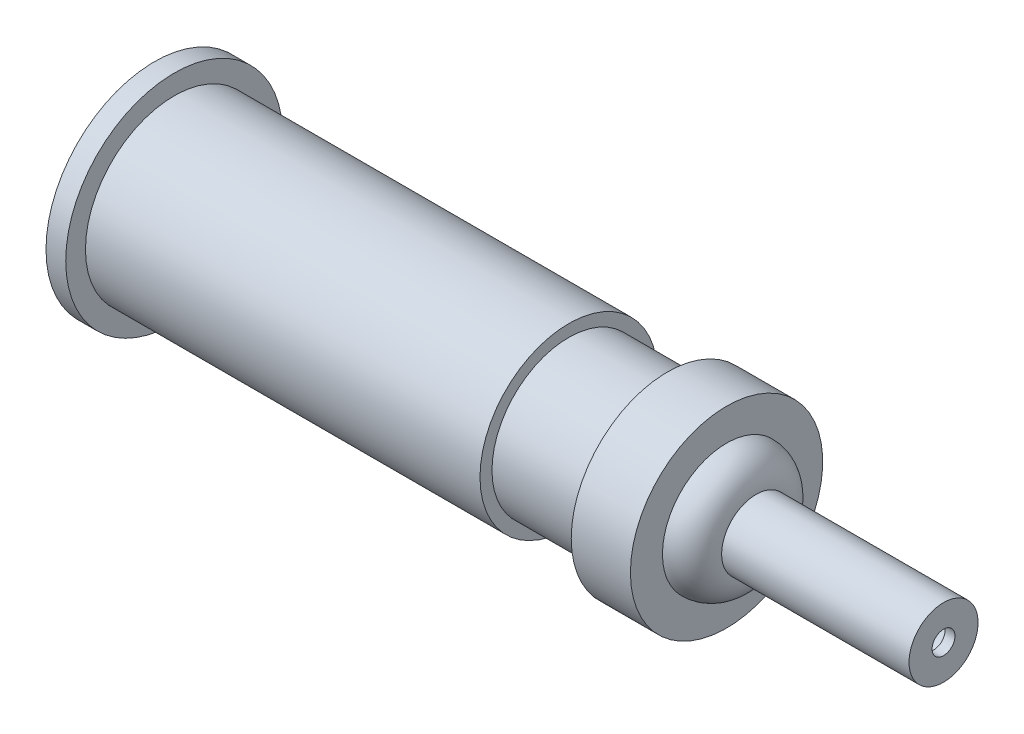
ISO-10303-21;
HEADER;
FILE_DESCRIPTION(('STEP AP214'),'2;1');
FILE_NAME('part.step','',(''),(''),'','','');
FILE_SCHEMA(('AUTOMOTIVE_DESIGN { 1 0 10303 214 1 1 1 1 }'));
ENDSEC;
DATA;
#1=APPLICATION_CONTEXT('core data for automotive mechanical design processes');
#2=APPLICATION_PROTOCOL_DEFINITION('international standard','automotive_design',2000,#1);
#3=PRODUCT_CONTEXT('',#1,'mechanical');
#4=PRODUCT('Part','Part','',(#3));
#5=PRODUCT_RELATED_PRODUCT_CATEGORY('part','',(#4));
#6=PRODUCT_DEFINITION_FORMATION('','',#4);
#7=PRODUCT_DEFINITION_CONTEXT('part definition',#1,'design');
#8=PRODUCT_DEFINITION('design','',#6,#7);
#9=PRODUCT_DEFINITION_SHAPE('','',#8);
#10=(LENGTH_UNIT() NAMED_UNIT(*) SI_UNIT(.MILLI.,.METRE.));
#11=(NAMED_UNIT(*) PLANE_ANGLE_UNIT() SI_UNIT($,.RADIAN.));
#12=(NAMED_UNIT(*) SI_UNIT($,.STERADIAN.) SOLID_ANGLE_UNIT());
#13=UNCERTAINTY_MEASURE_WITH_UNIT(LENGTH_MEASURE(1.E-05),#10,'distance_accuracy_value','');
#14=(GEOMETRIC_REPRESENTATION_CONTEXT(3) GLOBAL_UNCERTAINTY_ASSIGNED_CONTEXT((#13)) GLOBAL_UNIT_ASSIGNED_CONTEXT((#10,
#11,#12)) REPRESENTATION_CONTEXT('',''));
#15=CARTESIAN_POINT('',(0.,0.,0.));
#16=DIRECTION('',(0.,0.,1.));
#17=DIRECTION('',(1.,0.,0.));
#18=AXIS2_PLACEMENT_3D('',#15,#16,#17);
#19=CARTESIAN_POINT('',(79.,3.5,0.));
#20=DIRECTION('',(1.,0.,0.));
#21=DIRECTION('',(0.,0.,-1.));
#22=AXIS2_PLACEMENT_3D('',#19,#20,#21);
#23=PLANE('',#22);
#24=CARTESIAN_POINT('',(79.,0.,0.));
#25=DIRECTION('',(-1.,0.,0.));
#26=DIRECTION('',(0.,0.,1.));
#27=AXIS2_PLACEMENT_3D('',#24,#25,#26);
#28=CIRCLE('',#27,1.1608187134503);
#29=CARTESIAN_POINT('',(79.,0.,1.1608187134503));
#30=VERTEX_POINT('',#29);
#31=EDGE_CURVE('E132',#30,#30,#28,.T.);
#32=ORIENTED_EDGE('',*,*,#31,.F.);
#33=EDGE_LOOP('',(#32));
#34=FACE_BOUND('',#33,.T.);
#35=CARTESIAN_POINT('',(79.,0.,0.));
#36=DIRECTION('',(-1.,0.,0.));
#37=DIRECTION('',(0.,0.,1.));
#38=AXIS2_PLACEMENT_3D('',#35,#36,#37);
#39=CIRCLE('',#38,2.5);
#40=CARTESIAN_POINT('',(79.,0.,2.5));
#41=VERTEX_POINT('',#40);
#42=EDGE_CURVE('E10',#41,#41,#39,.T.);
#43=ORIENTED_EDGE('',*,*,#42,.T.);
#44=EDGE_LOOP('',(#43));
#45=FACE_BOUND('',#44,.T.);
#46=ADVANCED_FACE('F41',(#34,#45),#23,.F.);
#47=CARTESIAN_POINT('',(0.,0.,0.));
#48=DIRECTION('',(-1.,0.,0.));
#49=DIRECTION('',(0.,0.,1.));
#50=AXIS2_PLACEMENT_3D('',#47,#48,#49);
#51=CYLINDRICAL_SURFACE('',#50,2.5);
#52=ORIENTED_EDGE('',*,*,#42,.F.);
#53=EDGE_LOOP('',(#52));
#54=FACE_BOUND('',#53,.T.);
#55=CARTESIAN_POINT('',(59.7320508075689,0.,0.));
#56=DIRECTION('',(-1.,0.,0.));
#57=DIRECTION('',(0.,0.,1.));
#58=AXIS2_PLACEMENT_3D('',#55,#56,#57);
#59=CIRCLE('',#58,2.5);
#60=CARTESIAN_POINT('',(59.7320508075689,0.,2.5));
#61=VERTEX_POINT('',#60);
#62=EDGE_CURVE('E48',#61,#61,#59,.T.);
#63=ORIENTED_EDGE('',*,*,#62,.T.);
#64=EDGE_LOOP('',(#63));
#65=FACE_BOUND('',#64,.T.);
#66=ADVANCED_FACE('F141',(#54,#65),#51,.F.);
#67=CARTESIAN_POINT('',(58.,0.,0.));
#68=DIRECTION('',(-1.,0.,0.));
#69=DIRECTION('',(0.,0.,1.));
#70=AXIS2_PLACEMENT_3D('',#67,#68,#69);
#71=TOROIDAL_SURFACE('',#70,3.5,2.);
#72=ORIENTED_EDGE('',*,*,#62,.F.);
#73=EDGE_LOOP('',(#72));
#74=FACE_BOUND('',#73,.T.);
#75=CARTESIAN_POINT('',(57.,0.,0.));
#76=DIRECTION('',(-1.,0.,0.));
#77=DIRECTION('',(0.,0.,1.));
#78=AXIS2_PLACEMENT_3D('',#75,#76,#77);
#79=CIRCLE('',#78,5.23205080756888);
#80=CARTESIAN_POINT('',(57.,0.,5.23205080756888));
#81=VERTEX_POINT('',#80);
#82=EDGE_CURVE('E53',#81,#81,#79,.T.);
#83=ORIENTED_EDGE('',*,*,#82,.T.);
#84=EDGE_LOOP('',(#83));
#85=FACE_BOUND('',#84,.T.);
#86=ADVANCED_FACE('F145',(#74,#85),#71,.F.);
#87=CARTESIAN_POINT('',(57.,9.7485380116959,0.));
#88=DIRECTION('',(1.,0.,0.));
#89=DIRECTION('',(0.,0.,-1.));
#90=AXIS2_PLACEMENT_3D('',#87,#88,#89);
#91=PLANE('',#90);
#92=ORIENTED_EDGE('',*,*,#82,.F.);
#93=EDGE_LOOP('',(#92));
#94=FACE_BOUND('',#93,.T.);
#95=CARTESIAN_POINT('',(57.,0.,0.));
#96=DIRECTION('',(-1.,0.,0.));
#97=DIRECTION('',(0.,0.,1.));
#98=AXIS2_PLACEMENT_3D('',#95,#96,#97);
#99=CIRCLE('',#98,8.7485380116959);
#100=CARTESIAN_POINT('',(57.,0.,8.7485380116959));
#101=VERTEX_POINT('',#100);
#102=EDGE_CURVE('E58',#101,#101,#99,.T.);
#103=ORIENTED_EDGE('',*,*,#102,.T.);
#104=EDGE_LOOP('',(#103));
#105=FACE_BOUND('',#104,.T.);
#106=ADVANCED_FACE('F150',(#94,#105),#91,.F.);
#107=CARTESIAN_POINT('',(0.,0.,0.));
#108=DIRECTION('',(-1.,0.,0.));
#109=DIRECTION('',(0.,0.,1.));
#110=AXIS2_PLACEMENT_3D('',#107,#108,#109);
#111=CYLINDRICAL_SURFACE('',#110,8.7485380116959);
#112=ORIENTED_EDGE('',*,*,#102,.F.);
#113=EDGE_LOOP('',(#112));
#114=FACE_BOUND('',#113,.T.);
#115=CARTESIAN_POINT('',(53.,0.,0.));
#116=DIRECTION('',(-1.,0.,0.));
#117=DIRECTION('',(0.,0.,1.));
#118=AXIS2_PLACEMENT_3D('',#115,#116,#117);
#119=CIRCLE('',#118,8.7485380116959);
#120=CARTESIAN_POINT('',(53.,0.,8.7485380116959));
#121=VERTEX_POINT('',#120);
#122=EDGE_CURVE('E64',#121,#121,#119,.T.);
#123=ORIENTED_EDGE('',*,*,#122,.T.);
#124=EDGE_LOOP('',(#123));
#125=FACE_BOUND('',#124,.T.);
#126=ADVANCED_FACE('F156',(#114,#125),#111,.F.);
#127=CARTESIAN_POINT('',(53.,7.78362573099415,0.));
#128=DIRECTION('',(-1.,0.,0.));
#129=DIRECTION('',(0.,0.,1.));
#130=AXIS2_PLACEMENT_3D('',#127,#128,#129);
#131=PLANE('',#130);
#132=ORIENTED_EDGE('',*,*,#122,.F.);
#133=EDGE_LOOP('',(#132));
#134=FACE_BOUND('',#133,.T.);
#135=CARTESIAN_POINT('',(53.,0.,0.));
#136=DIRECTION('',(-1.,0.,0.));
#137=DIRECTION('',(0.,0.,1.));
#138=AXIS2_PLACEMENT_3D('',#135,#136,#137);
#139=CIRCLE('',#138,6.78362573099415);
#140=CARTESIAN_POINT('',(53.,0.,6.78362573099415));
#141=VERTEX_POINT('',#140);
#142=EDGE_CURVE('E68',#141,#141,#139,.T.);
#143=ORIENTED_EDGE('',*,*,#142,.T.);
#144=EDGE_LOOP('',(#143));
#145=FACE_BOUND('',#144,.T.);
#146=ADVANCED_FACE('F160',(#134,#145),#131,.F.);
#147=CARTESIAN_POINT('',(0.,0.,0.));
#148=DIRECTION('',(-1.,0.,0.));
#149=DIRECTION('',(0.,0.,1.));
#150=AXIS2_PLACEMENT_3D('',#147,#148,#149);
#151=CYLINDRICAL_SURFACE('',#150,6.78362573099415);
#152=ORIENTED_EDGE('',*,*,#142,.F.);
#153=EDGE_LOOP('',(#152));
#154=FACE_BOUND('',#153,.T.);
#155=CARTESIAN_POINT('',(41.,0.,0.));
#156=DIRECTION('',(-1.,0.,0.));
#157=DIRECTION('',(0.,0.,1.));
#158=AXIS2_PLACEMENT_3D('',#155,#156,#157);
#159=CIRCLE('',#158,6.78362573099415);
#160=CARTESIAN_POINT('',(41.,0.,6.78362573099415));
#161=VERTEX_POINT('',#160);
#162=EDGE_CURVE('E72',#161,#161,#159,.T.);
#163=ORIENTED_EDGE('',*,*,#162,.T.);
#164=EDGE_LOOP('',(#163));
#165=FACE_BOUND('',#164,.T.);
#166=ADVANCED_FACE('F164',(#154,#165),#151,.F.);
#167=CARTESIAN_POINT('',(41.,9.,0.));
#168=DIRECTION('',(1.,0.,0.));
#169=DIRECTION('',(0.,0.,-1.));
#170=AXIS2_PLACEMENT_3D('',#167,#168,#169);
#171=PLANE('',#170);
#172=ORIENTED_EDGE('',*,*,#162,.F.);
#173=EDGE_LOOP('',(#172));
#174=FACE_BOUND('',#173,.T.);
#175=CARTESIAN_POINT('',(41.,0.,0.));
#176=DIRECTION('',(-1.,0.,0.));
#177=DIRECTION('',(0.,0.,1.));
#178=AXIS2_PLACEMENT_3D('',#175,#176,#177);
#179=CIRCLE('',#178,8.);
#180=CARTESIAN_POINT('',(41.,0.,8.));
#181=VERTEX_POINT('',#180);
#182=EDGE_CURVE('E76',#181,#181,#179,.T.);
#183=ORIENTED_EDGE('',*,*,#182,.T.);
#184=EDGE_LOOP('',(#183));
#185=FACE_BOUND('',#184,.T.);
#186=ADVANCED_FACE('F168',(#174,#185),#171,.F.);
#187=CARTESIAN_POINT('',(0.,0.,0.));
#188=DIRECTION('',(-1.,0.,0.));
#189=DIRECTION('',(0.,0.,1.));
#190=AXIS2_PLACEMENT_3D('',#187,#188,#189);
#191=CYLINDRICAL_SURFACE('',#190,8.);
#192=ORIENTED_EDGE('',*,*,#182,.F.);
#193=EDGE_LOOP('',(#192));
#194=FACE_BOUND('',#193,.T.);
#195=CARTESIAN_POINT('',(1.,0.,0.));
#196=DIRECTION('',(-1.,0.,0.));
#197=DIRECTION('',(0.,0.,1.));
#198=AXIS2_PLACEMENT_3D('',#195,#196,#197);
#199=CIRCLE('',#198,8.);
#200=CARTESIAN_POINT('',(1.,0.,8.));
#201=VERTEX_POINT('',#200);
#202=EDGE_CURVE('E80',#201,#201,#199,.T.);
#203=ORIENTED_EDGE('',*,*,#202,.T.);
#204=EDGE_LOOP('',(#203));
#205=FACE_BOUND('',#204,.T.);
#206=ADVANCED_FACE('F172',(#194,#205),#191,.F.);
#207=CARTESIAN_POINT('',(1.,0.,0.));
#208=DIRECTION('',(-1.,0.,0.));
#209=DIRECTION('',(0.,0.,1.));
#210=AXIS2_PLACEMENT_3D('',#207,#208,#209);
#211=PLANE('',#210);
#212=ORIENTED_EDGE('',*,*,#202,.F.);
#213=EDGE_LOOP('',(#212));
#214=FACE_BOUND('',#213,.T.);
#215=ADVANCED_FACE('F176',(#214),#211,.F.);
#216=CARTESIAN_POINT('',(0.,0.,0.));
#217=DIRECTION('',(-1.,0.,0.));
#218=DIRECTION('',(0.,0.,1.));
#219=AXIS2_PLACEMENT_3D('',#216,#217,#218);
#220=PLANE('',#219);
#221=CARTESIAN_POINT('',(0.,0.,0.));
#222=DIRECTION('',(-1.,0.,0.));
#223=DIRECTION('',(0.,0.,1.));
#224=AXIS2_PLACEMENT_3D('',#221,#222,#223);
#225=CIRCLE('',#224,11.);
#226=CARTESIAN_POINT('',(0.,0.,11.));
#227=VERTEX_POINT('',#226);
#228=EDGE_CURVE('E84',#227,#227,#225,.T.);
#229=ORIENTED_EDGE('',*,*,#228,.T.);
#230=EDGE_LOOP('',(#229));
#231=FACE_BOUND('',#230,.T.);
#232=ADVANCED_FACE('F180',(#231),#220,.T.);
#233=CARTESIAN_POINT('',(0.,0.,0.));
#234=DIRECTION('',(-1.,0.,0.));
#235=DIRECTION('',(0.,0.,1.));
#236=AXIS2_PLACEMENT_3D('',#233,#234,#235);
#237=CYLINDRICAL_SURFACE('',#236,11.);
#238=CARTESIAN_POINT('',(2.,0.,0.));
#239=DIRECTION('',(-1.,0.,0.));
#240=DIRECTION('',(0.,0.,1.));
#241=AXIS2_PLACEMENT_3D('',#238,#239,#240);
#242=CIRCLE('',#241,11.);
#243=CARTESIAN_POINT('',(2.,0.,11.));
#244=VERTEX_POINT('',#243);
#245=EDGE_CURVE('E88',#244,#244,#242,.T.);
#246=ORIENTED_EDGE('',*,*,#245,.T.);
#247=EDGE_LOOP('',(#246));
#248=FACE_BOUND('',#247,.T.);
#249=ORIENTED_EDGE('',*,*,#228,.F.);
#250=EDGE_LOOP('',(#249));
#251=FACE_BOUND('',#250,.T.);
#252=ADVANCED_FACE('F184',(#248,#251),#237,.T.);
#253=CARTESIAN_POINT('',(2.,11.,0.));
#254=DIRECTION('',(1.,0.,0.));
#255=DIRECTION('',(0.,0.,-1.));
#256=AXIS2_PLACEMENT_3D('',#253,#254,#255);
#257=PLANE('',#256);
#258=CARTESIAN_POINT('',(2.,0.,0.));
#259=DIRECTION('',(-1.,0.,0.));
#260=DIRECTION('',(0.,0.,1.));
#261=AXIS2_PLACEMENT_3D('',#258,#259,#260);
#262=CIRCLE('',#261,9.);
#263=CARTESIAN_POINT('',(2.,0.,9.));
#264=VERTEX_POINT('',#263);
#265=EDGE_CURVE('E92',#264,#264,#262,.T.);
#266=ORIENTED_EDGE('',*,*,#265,.T.);
#267=EDGE_LOOP('',(#266));
#268=FACE_BOUND('',#267,.T.);
#269=ORIENTED_EDGE('',*,*,#245,.F.);
#270=EDGE_LOOP('',(#269));
#271=FACE_BOUND('',#270,.T.);
#272=ADVANCED_FACE('F188',(#268,#271),#257,.T.);
#273=CARTESIAN_POINT('',(0.,0.,0.));
#274=DIRECTION('',(-1.,0.,0.));
#275=DIRECTION('',(0.,0.,1.));
#276=AXIS2_PLACEMENT_3D('',#273,#274,#275);
#277=CYLINDRICAL_SURFACE('',#276,9.);
#278=CARTESIAN_POINT('',(42.,0.,0.));
#279=DIRECTION('',(-1.,0.,0.));
#280=DIRECTION('',(0.,0.,1.));
#281=AXIS2_PLACEMENT_3D('',#278,#279,#280);
#282=CIRCLE('',#281,9.);
#283=CARTESIAN_POINT('',(42.,0.,9.));
#284=VERTEX_POINT('',#283);
#285=EDGE_CURVE('E96',#284,#284,#282,.T.);
#286=ORIENTED_EDGE('',*,*,#285,.T.);
#287=EDGE_LOOP('',(#286));
#288=FACE_BOUND('',#287,.T.);
#289=ORIENTED_EDGE('',*,*,#265,.F.);
#290=EDGE_LOOP('',(#289));
#291=FACE_BOUND('',#290,.T.);
#292=ADVANCED_FACE('F192',(#288,#291),#277,.T.);
#293=CARTESIAN_POINT('',(42.,9.,0.));
#294=DIRECTION('',(1.,0.,0.));
#295=DIRECTION('',(0.,0.,-1.));
#296=AXIS2_PLACEMENT_3D('',#293,#294,#295);
#297=PLANE('',#296);
#298=CARTESIAN_POINT('',(42.,0.,0.));
#299=DIRECTION('',(-1.,0.,0.));
#300=DIRECTION('',(0.,0.,1.));
#301=AXIS2_PLACEMENT_3D('',#298,#299,#300);
#302=CIRCLE('',#301,7.78362573099415);
#303=CARTESIAN_POINT('',(42.,0.,7.78362573099415));
#304=VERTEX_POINT('',#303);
#305=EDGE_CURVE('E100',#304,#304,#302,.T.);
#306=ORIENTED_EDGE('',*,*,#305,.T.);
#307=EDGE_LOOP('',(#306));
#308=FACE_BOUND('',#307,.T.);
#309=ORIENTED_EDGE('',*,*,#285,.F.);
#310=EDGE_LOOP('',(#309));
#311=FACE_BOUND('',#310,.T.);
#312=ADVANCED_FACE('F196',(#308,#311),#297,.T.);
#313=CARTESIAN_POINT('',(0.,0.,0.));
#314=DIRECTION('',(-1.,0.,0.));
#315=DIRECTION('',(0.,0.,1.));
#316=AXIS2_PLACEMENT_3D('',#313,#314,#315);
#317=CYLINDRICAL_SURFACE('',#316,7.78362573099415);
#318=CARTESIAN_POINT('',(52.,0.,0.));
#319=DIRECTION('',(-1.,0.,0.));
#320=DIRECTION('',(0.,0.,1.));
#321=AXIS2_PLACEMENT_3D('',#318,#319,#320);
#322=CIRCLE('',#321,7.78362573099415);
#323=CARTESIAN_POINT('',(52.,0.,7.78362573099415));
#324=VERTEX_POINT('',#323);
#325=EDGE_CURVE('E104',#324,#324,#322,.T.);
#326=ORIENTED_EDGE('',*,*,#325,.T.);
#327=EDGE_LOOP('',(#326));
#328=FACE_BOUND('',#327,.T.);
#329=ORIENTED_EDGE('',*,*,#305,.F.);
#330=EDGE_LOOP('',(#329));
#331=FACE_BOUND('',#330,.T.);
#332=ADVANCED_FACE('F200',(#328,#331),#317,.T.);
#333=CARTESIAN_POINT('',(52.,7.78362573099415,0.));
#334=DIRECTION('',(-1.,0.,0.));
#335=DIRECTION('',(0.,0.,1.));
#336=AXIS2_PLACEMENT_3D('',#333,#334,#335);
#337=PLANE('',#336);
#338=CARTESIAN_POINT('',(52.,0.,0.));
#339=DIRECTION('',(-1.,0.,0.));
#340=DIRECTION('',(0.,0.,1.));
#341=AXIS2_PLACEMENT_3D('',#338,#339,#340);
#342=CIRCLE('',#341,9.7485380116959);
#343=CARTESIAN_POINT('',(52.,0.,9.7485380116959));
#344=VERTEX_POINT('',#343);
#345=EDGE_CURVE('E108',#344,#344,#342,.T.);
#346=ORIENTED_EDGE('',*,*,#345,.T.);
#347=EDGE_LOOP('',(#346));
#348=FACE_BOUND('',#347,.T.);
#349=ORIENTED_EDGE('',*,*,#325,.F.);
#350=EDGE_LOOP('',(#349));
#351=FACE_BOUND('',#350,.T.);
#352=ADVANCED_FACE('F204',(#348,#351),#337,.T.);
#353=CARTESIAN_POINT('',(0.,0.,0.));
#354=DIRECTION('',(-1.,0.,0.));
#355=DIRECTION('',(0.,0.,1.));
#356=AXIS2_PLACEMENT_3D('',#353,#354,#355);
#357=CYLINDRICAL_SURFACE('',#356,9.7485380116959);
#358=CARTESIAN_POINT('',(58.,0.,0.));
#359=DIRECTION('',(-1.,0.,0.));
#360=DIRECTION('',(0.,0.,1.));
#361=AXIS2_PLACEMENT_3D('',#358,#359,#360);
#362=CIRCLE('',#361,9.7485380116959);
#363=CARTESIAN_POINT('',(58.,0.,9.7485380116959));
#364=VERTEX_POINT('',#363);
#365=EDGE_CURVE('E112',#364,#364,#362,.T.);
#366=ORIENTED_EDGE('',*,*,#365,.T.);
#367=EDGE_LOOP('',(#366));
#368=FACE_BOUND('',#367,.T.);
#369=ORIENTED_EDGE('',*,*,#345,.F.);
#370=EDGE_LOOP('',(#369));
#371=FACE_BOUND('',#370,.T.);
#372=ADVANCED_FACE('F208',(#368,#371),#357,.T.);
#373=CARTESIAN_POINT('',(58.,9.7485380116959,0.));
#374=DIRECTION('',(1.,0.,0.));
#375=DIRECTION('',(0.,0.,-1.));
#376=AXIS2_PLACEMENT_3D('',#373,#374,#375);
#377=PLANE('',#376);
#378=CARTESIAN_POINT('',(58.,0.,0.));
#379=DIRECTION('',(-1.,0.,0.));
#380=DIRECTION('',(0.,0.,1.));
#381=AXIS2_PLACEMENT_3D('',#378,#379,#380);
#382=CIRCLE('',#381,6.5);
#383=CARTESIAN_POINT('',(58.,0.,6.5));
#384=VERTEX_POINT('',#383);
#385=EDGE_CURVE('E116',#384,#384,#382,.T.);
#386=ORIENTED_EDGE('',*,*,#385,.T.);
#387=EDGE_LOOP('',(#386));
#388=FACE_BOUND('',#387,.T.);
#389=ORIENTED_EDGE('',*,*,#365,.F.);
#390=EDGE_LOOP('',(#389));
#391=FACE_BOUND('',#390,.T.);
#392=ADVANCED_FACE('F212',(#388,#391),#377,.T.);
#393=CARTESIAN_POINT('',(58.,0.,0.));
#394=DIRECTION('',(-1.,0.,0.));
#395=DIRECTION('',(0.,0.,1.));
#396=AXIS2_PLACEMENT_3D('',#393,#394,#395);
#397=TOROIDAL_SURFACE('',#396,3.5,3.);
#398=CARTESIAN_POINT('',(61.,0.,0.));
#399=DIRECTION('',(-1.,0.,0.));
#400=DIRECTION('',(0.,0.,1.));
#401=AXIS2_PLACEMENT_3D('',#398,#399,#400);
#402=CIRCLE('',#401,3.5);
#403=CARTESIAN_POINT('',(61.,0.,3.5));
#404=VERTEX_POINT('',#403);
#405=EDGE_CURVE('E120',#404,#404,#402,.T.);
#406=ORIENTED_EDGE('',*,*,#405,.T.);
#407=EDGE_LOOP('',(#406));
#408=FACE_BOUND('',#407,.T.);
#409=ORIENTED_EDGE('',*,*,#385,.F.);
#410=EDGE_LOOP('',(#409));
#411=FACE_BOUND('',#410,.T.);
#412=ADVANCED_FACE('F216',(#408,#411),#397,.T.);
#413=CARTESIAN_POINT('',(0.,0.,0.));
#414=DIRECTION('',(-1.,0.,0.));
#415=DIRECTION('',(0.,0.,1.));
#416=AXIS2_PLACEMENT_3D('',#413,#414,#415);
#417=CYLINDRICAL_SURFACE('',#416,3.5);
#418=CARTESIAN_POINT('',(80.,0.,0.));
#419=DIRECTION('',(-1.,0.,0.));
#420=DIRECTION('',(0.,0.,1.));
#421=AXIS2_PLACEMENT_3D('',#418,#419,#420);
#422=CIRCLE('',#421,3.5);
#423=CARTESIAN_POINT('',(80.,0.,3.5));
#424=VERTEX_POINT('',#423);
#425=EDGE_CURVE('E124',#424,#424,#422,.T.);
#426=ORIENTED_EDGE('',*,*,#425,.T.);
#427=EDGE_LOOP('',(#426));
#428=FACE_BOUND('',#427,.T.);
#429=ORIENTED_EDGE('',*,*,#405,.F.);
#430=EDGE_LOOP('',(#429));
#431=FACE_BOUND('',#430,.T.);
#432=ADVANCED_FACE('F220',(#428,#431),#417,.T.);
#433=CARTESIAN_POINT('',(80.,3.5,0.));
#434=DIRECTION('',(1.,0.,0.));
#435=DIRECTION('',(0.,0.,-1.));
#436=AXIS2_PLACEMENT_3D('',#433,#434,#435);
#437=PLANE('',#436);
#438=CARTESIAN_POINT('',(80.,0.,0.));
#439=DIRECTION('',(-1.,0.,0.));
#440=DIRECTION('',(0.,0.,1.));
#441=AXIS2_PLACEMENT_3D('',#438,#439,#440);
#442=CIRCLE('',#441,1.1608187134503);
#443=CARTESIAN_POINT('',(80.,0.,1.1608187134503));
#444=VERTEX_POINT('',#443);
#445=EDGE_CURVE('E128',#444,#444,#442,.T.);
#446=ORIENTED_EDGE('',*,*,#445,.T.);
#447=EDGE_LOOP('',(#446));
#448=FACE_BOUND('',#447,.T.);
#449=ORIENTED_EDGE('',*,*,#425,.F.);
#450=EDGE_LOOP('',(#449));
#451=FACE_BOUND('',#450,.T.);
#452=ADVANCED_FACE('F224',(#448,#451),#437,.T.);
#453=CARTESIAN_POINT('',(0.,0.,0.));
#454=DIRECTION('',(-1.,0.,0.));
#455=DIRECTION('',(0.,0.,1.));
#456=AXIS2_PLACEMENT_3D('',#453,#454,#455);
#457=CYLINDRICAL_SURFACE('',#456,1.1608187134503);
#458=ORIENTED_EDGE('',*,*,#31,.T.);
#459=EDGE_LOOP('',(#458));
#460=FACE_BOUND('',#459,.T.);
#461=ORIENTED_EDGE('',*,*,#445,.F.);
#462=EDGE_LOOP('',(#461));
#463=FACE_BOUND('',#462,.T.);
#464=ADVANCED_FACE('F137',(#460,#463),#457,.F.);
#465=CLOSED_SHELL('',(#46,#66,#86,#106,#126,#146,#166,#186,#206,#215,#232,#252,#272,#292,#312,
#332,#352,#372,#392,#412,#432,#452,#464));
#466=MANIFOLD_SOLID_BREP('B2',#465);
#467=ADVANCED_BREP_SHAPE_REPRESENTATION('',(#18,#466),#14);
#468=SHAPE_DEFINITION_REPRESENTATION(#9,#467);
ENDSEC;
END-ISO-10303-21;
